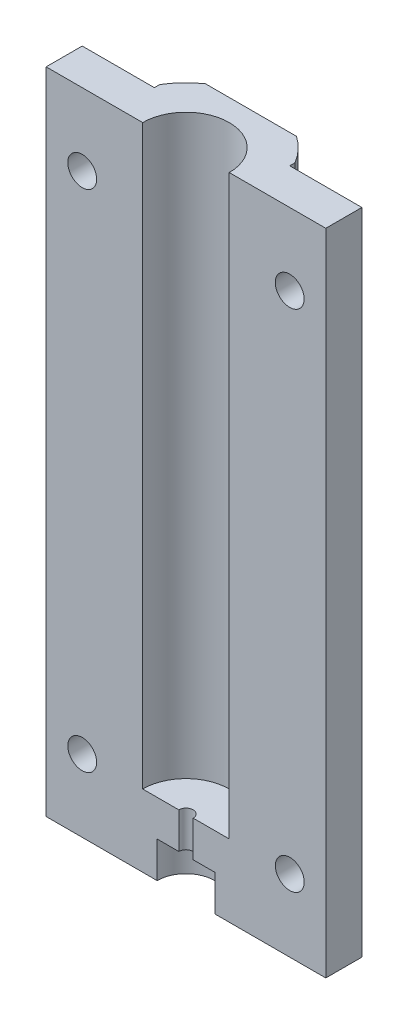
ISO-10303-21;
HEADER;
FILE_DESCRIPTION(('STEP AP214'),'2;1');
FILE_NAME('part.step','',(''),(''),'','','');
FILE_SCHEMA(('AUTOMOTIVE_DESIGN { 1 0 10303 214 1 1 1 1 }'));
ENDSEC;
DATA;
#1=APPLICATION_CONTEXT('core data for automotive mechanical design processes');
#2=APPLICATION_PROTOCOL_DEFINITION('international standard','automotive_design',2000,#1);
#3=PRODUCT_CONTEXT('',#1,'mechanical');
#4=PRODUCT('Part','Part','',(#3));
#5=PRODUCT_RELATED_PRODUCT_CATEGORY('part','',(#4));
#6=PRODUCT_DEFINITION_FORMATION('','',#4);
#7=PRODUCT_DEFINITION_CONTEXT('part definition',#1,'design');
#8=PRODUCT_DEFINITION('design','',#6,#7);
#9=PRODUCT_DEFINITION_SHAPE('','',#8);
#10=(LENGTH_UNIT() NAMED_UNIT(*) SI_UNIT(.MILLI.,.METRE.));
#11=(NAMED_UNIT(*) PLANE_ANGLE_UNIT() SI_UNIT($,.RADIAN.));
#12=(NAMED_UNIT(*) SI_UNIT($,.STERADIAN.) SOLID_ANGLE_UNIT());
#13=UNCERTAINTY_MEASURE_WITH_UNIT(LENGTH_MEASURE(1.E-05),#10,'distance_accuracy_value','');
#14=(GEOMETRIC_REPRESENTATION_CONTEXT(3) GLOBAL_UNCERTAINTY_ASSIGNED_CONTEXT((#13)) GLOBAL_UNIT_ASSIGNED_CONTEXT((#10,
#11,#12)) REPRESENTATION_CONTEXT('',''));
#15=CARTESIAN_POINT('',(0.,0.,0.));
#16=DIRECTION('',(0.,0.,1.));
#17=DIRECTION('',(1.,0.,0.));
#18=AXIS2_PLACEMENT_3D('',#15,#16,#17);
#19=CARTESIAN_POINT('',(0.,0.,0.));
#20=DIRECTION('',(0.,-1.,0.));
#21=DIRECTION('',(0.,0.,1.));
#22=AXIS2_PLACEMENT_3D('',#19,#20,#21);
#23=CYLINDRICAL_SURFACE('',#22,11.);
#24=CARTESIAN_POINT('',(0.,90.,0.));
#25=DIRECTION('',(0.,1.,0.));
#26=DIRECTION('',(0.,0.,1.));
#27=AXIS2_PLACEMENT_3D('',#24,#25,#26);
#28=CIRCLE('',#27,11.);
#29=CARTESIAN_POINT('',(-6.31136113976325,90.,-9.00925749235121));
#30=VERTEX_POINT('',#29);
#31=CARTESIAN_POINT('',(-9.3806248631069,90.,-5.74490010162584));
#32=VERTEX_POINT('',#31);
#33=EDGE_CURVE('E160',#30,#32,#28,.T.);
#34=ORIENTED_EDGE('',*,*,#33,.F.);
#35=DIRECTION('',(0.,-1.,0.));
#36=VECTOR('',#35,1.);
#37=CARTESIAN_POINT('',(-6.31136113976325,0.,-9.00925749235121));
#38=LINE('',#37,#36);
#39=CARTESIAN_POINT('',(-6.31136113976325,0.,-9.00925749235121));
#40=VERTEX_POINT('',#39);
#41=EDGE_CURVE('E11',#30,#40,#38,.T.);
#42=ORIENTED_EDGE('',*,*,#41,.T.);
#43=CARTESIAN_POINT('',(0.,0.,0.));
#44=DIRECTION('',(0.,1.,0.));
#45=DIRECTION('',(0.,0.,1.));
#46=AXIS2_PLACEMENT_3D('',#43,#44,#45);
#47=CIRCLE('',#46,11.);
#48=CARTESIAN_POINT('',(-9.3806248631069,0.,-5.74490010162584));
#49=VERTEX_POINT('',#48);
#50=EDGE_CURVE('E173',#40,#49,#47,.T.);
#51=ORIENTED_EDGE('',*,*,#50,.T.);
#52=DIRECTION('',(0.,-1.,0.));
#53=VECTOR('',#52,1.);
#54=CARTESIAN_POINT('',(-9.3806248631069,319.125736867983,-5.74490010162584));
#55=LINE('',#54,#53);
#56=EDGE_CURVE('E168',#32,#49,#55,.T.);
#57=ORIENTED_EDGE('',*,*,#56,.F.);
#58=EDGE_LOOP('',(#34,#42,#51,#57));
#59=FACE_BOUND('',#58,.T.);
#60=ADVANCED_FACE('F39',(#59),#23,.T.);
#61=CARTESIAN_POINT('',(0.,20.,0.));
#62=DIRECTION('',(0.,-1.,0.));
#63=DIRECTION('',(0.,0.,-1.));
#64=AXIS2_PLACEMENT_3D('',#61,#62,#63);
#65=CYLINDRICAL_SURFACE('',#64,1.);
#66=CARTESIAN_POINT('',(0.,5.,0.));
#67=DIRECTION('',(0.,-1.,0.));
#68=DIRECTION('',(0.,0.,-1.));
#69=AXIS2_PLACEMENT_3D('',#66,#67,#68);
#70=CIRCLE('',#69,1.);
#71=CARTESIAN_POINT('',(1.,5.,0.));
#72=VERTEX_POINT('',#71);
#73=CARTESIAN_POINT('',(-1.,5.,0.));
#74=VERTEX_POINT('',#73);
#75=EDGE_CURVE('E266',#72,#74,#70,.F.);
#76=ORIENTED_EDGE('',*,*,#75,.F.);
#77=DIRECTION('',(0.,-1.,0.));
#78=VECTOR('',#77,1.);
#79=CARTESIAN_POINT('',(1.,20.,0.));
#80=LINE('',#79,#78);
#81=CARTESIAN_POINT('',(1.,9.99999999999999,0.));
#82=VERTEX_POINT('',#81);
#83=EDGE_CURVE('E212',#72,#82,#80,.F.);
#84=ORIENTED_EDGE('',*,*,#83,.T.);
#85=CARTESIAN_POINT('',(0.,9.99999999999999,0.));
#86=DIRECTION('',(0.,-1.,0.));
#87=DIRECTION('',(0.,0.,-1.));
#88=AXIS2_PLACEMENT_3D('',#85,#86,#87);
#89=CIRCLE('',#88,1.);
#90=CARTESIAN_POINT('',(-1.,9.99999999999999,0.));
#91=VERTEX_POINT('',#90);
#92=EDGE_CURVE('E204',#91,#82,#89,.T.);
#93=ORIENTED_EDGE('',*,*,#92,.F.);
#94=DIRECTION('',(0.,-1.,0.));
#95=VECTOR('',#94,1.);
#96=CARTESIAN_POINT('',(-1.,20.,0.));
#97=LINE('',#96,#95);
#98=EDGE_CURVE('E208',#91,#74,#97,.T.);
#99=ORIENTED_EDGE('',*,*,#98,.T.);
#100=EDGE_LOOP('',(#76,#84,#93,#99));
#101=FACE_BOUND('',#100,.T.);
#102=ADVANCED_FACE('F381',(#101),#65,.F.);
#103=CARTESIAN_POINT('',(0.,0.,0.));
#104=DIRECTION('',(0.,1.,0.));
#105=DIRECTION('',(0.,0.,1.));
#106=AXIS2_PLACEMENT_3D('',#103,#104,#105);
#107=PLANE('',#106);
#108=ORIENTED_EDGE('',*,*,#50,.F.);
#109=DIRECTION('',(1.,0.,0.));
#110=VECTOR('',#109,1.);
#111=CARTESIAN_POINT('',(-10.4548474663646,0.,-9.00925749235121));
#112=LINE('',#111,#110);
#113=CARTESIAN_POINT('',(6.31136113976325,0.,-9.00925749235121));
#114=VERTEX_POINT('',#113);
#115=EDGE_CURVE('E152',#40,#114,#112,.T.);
#116=ORIENTED_EDGE('',*,*,#115,.T.);
#117=CARTESIAN_POINT('',(9.38062486310674,0.,-5.74490010162611));
#118=VERTEX_POINT('',#117);
#119=EDGE_CURVE('E178',#118,#114,#47,.T.);
#120=ORIENTED_EDGE('',*,*,#119,.F.);
#121=DIRECTION('',(0.,0.,-1.));
#122=VECTOR('',#121,1.);
#123=CARTESIAN_POINT('',(9.38062486310674,0.,-5.74490010162611));
#124=LINE('',#123,#122);
#125=CARTESIAN_POINT('',(9.38062486310675,0.,-5.00000000000013));
#126=VERTEX_POINT('',#125);
#127=EDGE_CURVE('E336',#126,#118,#124,.T.);
#128=ORIENTED_EDGE('',*,*,#127,.F.);
#129=DIRECTION('',(1.,0.,0.));
#130=VECTOR('',#129,1.);
#131=CARTESIAN_POINT('',(9.38062486310675,0.,-5.00000000000013));
#132=LINE('',#131,#130);
#133=CARTESIAN_POINT('',(19.3806248631068,0.,-5.00000000000027));
#134=VERTEX_POINT('',#133);
#135=EDGE_CURVE('E309',#126,#134,#132,.T.);
#136=ORIENTED_EDGE('',*,*,#135,.T.);
#137=DIRECTION('',(0.,0.,-1.));
#138=VECTOR('',#137,1.);
#139=CARTESIAN_POINT('',(19.3806248631068,0.,0.));
#140=LINE('',#139,#138);
#141=CARTESIAN_POINT('',(19.3806248631068,0.,0.));
#142=VERTEX_POINT('',#141);
#143=EDGE_CURVE('E183',#142,#134,#140,.T.);
#144=ORIENTED_EDGE('',*,*,#143,.F.);
#145=DIRECTION('',(1.,0.,0.));
#146=VECTOR('',#145,1.);
#147=CARTESIAN_POINT('',(-19.3806248631068,0.,0.));
#148=LINE('',#147,#146);
#149=CARTESIAN_POINT('',(4.,0.,0.));
#150=VERTEX_POINT('',#149);
#151=EDGE_CURVE('E278',#150,#142,#148,.T.);
#152=ORIENTED_EDGE('',*,*,#151,.F.);
#153=CARTESIAN_POINT('',(0.,0.,0.));
#154=DIRECTION('',(0.,-1.,0.));
#155=DIRECTION('',(0.,0.,-1.));
#156=AXIS2_PLACEMENT_3D('',#153,#154,#155);
#157=CIRCLE('',#156,4.);
#158=CARTESIAN_POINT('',(-4.,0.,0.));
#159=VERTEX_POINT('',#158);
#160=EDGE_CURVE('E260',#159,#150,#157,.T.);
#161=ORIENTED_EDGE('',*,*,#160,.F.);
#162=CARTESIAN_POINT('',(-19.3806248631068,0.,0.));
#163=VERTEX_POINT('',#162);
#164=EDGE_CURVE('E285',#163,#159,#148,.T.);
#165=ORIENTED_EDGE('',*,*,#164,.F.);
#166=DIRECTION('',(0.,0.,1.));
#167=VECTOR('',#166,1.);
#168=CARTESIAN_POINT('',(-19.3806248631068,0.,0.));
#169=LINE('',#168,#167);
#170=CARTESIAN_POINT('',(-19.3806248631069,0.,-4.99999999999973));
#171=VERTEX_POINT('',#170);
#172=EDGE_CURVE('E189',#171,#163,#169,.T.);
#173=ORIENTED_EDGE('',*,*,#172,.F.);
#174=DIRECTION('',(1.,0.,0.));
#175=VECTOR('',#174,1.);
#176=CARTESIAN_POINT('',(-9.38062486310688,0.,-4.99999999999987));
#177=LINE('',#176,#175);
#178=CARTESIAN_POINT('',(-9.38062486310688,0.,-4.99999999999987));
#179=VERTEX_POINT('',#178);
#180=EDGE_CURVE('E325',#171,#179,#177,.T.);
#181=ORIENTED_EDGE('',*,*,#180,.T.);
#182=DIRECTION('',(0.,0.,-1.));
#183=VECTOR('',#182,1.);
#184=CARTESIAN_POINT('',(-9.3806248631069,0.,-5.74490010162584));
#185=LINE('',#184,#183);
#186=EDGE_CURVE('E174',#179,#49,#185,.T.);
#187=ORIENTED_EDGE('',*,*,#186,.T.);
#188=EDGE_LOOP('',(#108,#116,#120,#128,#136,#144,#152,#161,#165,#173,#181,#187));
#189=FACE_BOUND('',#188,.T.);
#190=ADVANCED_FACE('F41',(#189),#107,.F.);
#191=CARTESIAN_POINT('',(11.,90.,0.));
#192=DIRECTION('',(0.,-1.,0.));
#193=DIRECTION('',(0.,0.,-1.));
#194=AXIS2_PLACEMENT_3D('',#191,#192,#193);
#195=PLANE('',#194);
#196=CARTESIAN_POINT('',(9.38062486310674,90.,-5.74490010162611));
#197=VERTEX_POINT('',#196);
#198=CARTESIAN_POINT('',(6.31136113976325,90.,-9.00925749235121));
#199=VERTEX_POINT('',#198);
#200=EDGE_CURVE('E163',#197,#199,#28,.T.);
#201=ORIENTED_EDGE('',*,*,#200,.T.);
#202=DIRECTION('',(1.,0.,0.));
#203=VECTOR('',#202,1.);
#204=CARTESIAN_POINT('',(-10.4548474663646,90.,-9.00925749235121));
#205=LINE('',#204,#203);
#206=EDGE_CURVE('E55',#30,#199,#205,.T.);
#207=ORIENTED_EDGE('',*,*,#206,.F.);
#208=ORIENTED_EDGE('',*,*,#33,.T.);
#209=DIRECTION('',(0.,0.,-1.));
#210=VECTOR('',#209,1.);
#211=CARTESIAN_POINT('',(-9.3806248631069,90.,-5.74490010162584));
#212=LINE('',#211,#210);
#213=CARTESIAN_POINT('',(-9.38062486310688,90.,-4.99999999999987));
#214=VERTEX_POINT('',#213);
#215=EDGE_CURVE('E350',#214,#32,#212,.T.);
#216=ORIENTED_EDGE('',*,*,#215,.F.);
#217=DIRECTION('',(1.,0.,0.));
#218=VECTOR('',#217,1.);
#219=CARTESIAN_POINT('',(-9.38062486310688,90.,-4.99999999999987));
#220=LINE('',#219,#218);
#221=CARTESIAN_POINT('',(-19.3806248631069,90.,-4.99999999999973));
#222=VERTEX_POINT('',#221);
#223=EDGE_CURVE('E321',#222,#214,#220,.T.);
#224=ORIENTED_EDGE('',*,*,#223,.F.);
#225=DIRECTION('',(0.,0.,1.));
#226=VECTOR('',#225,1.);
#227=CARTESIAN_POINT('',(-19.3806248631068,90.,0.));
#228=LINE('',#227,#226);
#229=CARTESIAN_POINT('',(-19.3806248631068,90.,0.));
#230=VERTEX_POINT('',#229);
#231=EDGE_CURVE('E186',#222,#230,#228,.T.);
#232=ORIENTED_EDGE('',*,*,#231,.T.);
#233=DIRECTION('',(1.,0.,0.));
#234=VECTOR('',#233,1.);
#235=CARTESIAN_POINT('',(-19.3806248631068,90.,0.));
#236=LINE('',#235,#234);
#237=CARTESIAN_POINT('',(-5.99999999999999,90.,0.));
#238=VERTEX_POINT('',#237);
#239=EDGE_CURVE('E279',#230,#238,#236,.T.);
#240=ORIENTED_EDGE('',*,*,#239,.T.);
#241=CARTESIAN_POINT('',(0.,90.,0.));
#242=DIRECTION('',(0.,-1.,0.));
#243=DIRECTION('',(0.,0.,-1.));
#244=AXIS2_PLACEMENT_3D('',#241,#242,#243);
#245=CIRCLE('',#244,6.);
#246=CARTESIAN_POINT('',(5.99999999999999,90.,0.));
#247=VERTEX_POINT('',#246);
#248=EDGE_CURVE('E200',#238,#247,#245,.T.);
#249=ORIENTED_EDGE('',*,*,#248,.T.);
#250=CARTESIAN_POINT('',(19.3806248631068,90.,0.));
#251=VERTEX_POINT('',#250);
#252=EDGE_CURVE('E284',#247,#251,#236,.T.);
#253=ORIENTED_EDGE('',*,*,#252,.T.);
#254=DIRECTION('',(0.,0.,-1.));
#255=VECTOR('',#254,1.);
#256=CARTESIAN_POINT('',(19.3806248631068,90.,0.));
#257=LINE('',#256,#255);
#258=CARTESIAN_POINT('',(19.3806248631068,90.,-5.00000000000027));
#259=VERTEX_POINT('',#258);
#260=EDGE_CURVE('E182',#251,#259,#257,.T.);
#261=ORIENTED_EDGE('',*,*,#260,.T.);
#262=DIRECTION('',(1.,0.,0.));
#263=VECTOR('',#262,1.);
#264=CARTESIAN_POINT('',(9.38062486310675,90.,-5.00000000000013));
#265=LINE('',#264,#263);
#266=CARTESIAN_POINT('',(9.38062486310675,90.,-5.00000000000013));
#267=VERTEX_POINT('',#266);
#268=EDGE_CURVE('E308',#267,#259,#265,.T.);
#269=ORIENTED_EDGE('',*,*,#268,.F.);
#270=DIRECTION('',(0.,0.,-1.));
#271=VECTOR('',#270,1.);
#272=CARTESIAN_POINT('',(9.38062486310674,90.,-5.74490010162611));
#273=LINE('',#272,#271);
#274=EDGE_CURVE('E340',#267,#197,#273,.T.);
#275=ORIENTED_EDGE('',*,*,#274,.T.);
#276=EDGE_LOOP('',(#201,#207,#208,#216,#224,#232,#240,#249,#253,#261,#269,#275));
#277=FACE_BOUND('',#276,.T.);
#278=ADVANCED_FACE('F158',(#277),#195,.F.);
#279=CARTESIAN_POINT('',(0.,0.,0.));
#280=DIRECTION('',(0.,-1.,0.));
#281=DIRECTION('',(0.,0.,-1.));
#282=AXIS2_PLACEMENT_3D('',#279,#280,#281);
#283=CYLINDRICAL_SURFACE('',#282,5.99999999999999);
#284=CARTESIAN_POINT('',(0.,9.99999999999999,0.));
#285=DIRECTION('',(0.,-1.,0.));
#286=DIRECTION('',(0.,0.,-1.));
#287=AXIS2_PLACEMENT_3D('',#284,#285,#286);
#288=CIRCLE('',#287,5.99999999999999);
#289=CARTESIAN_POINT('',(-5.99999999999999,9.99999999999999,0.));
#290=VERTEX_POINT('',#289);
#291=CARTESIAN_POINT('',(5.99999999999999,9.99999999999999,0.));
#292=VERTEX_POINT('',#291);
#293=EDGE_CURVE('E193',#290,#292,#288,.T.);
#294=ORIENTED_EDGE('',*,*,#293,.T.);
#295=DIRECTION('',(0.,-1.,0.));
#296=VECTOR('',#295,1.);
#297=CARTESIAN_POINT('',(5.99999999999999,0.,0.));
#298=LINE('',#297,#296);
#299=EDGE_CURVE('E304',#292,#247,#298,.F.);
#300=ORIENTED_EDGE('',*,*,#299,.T.);
#301=ORIENTED_EDGE('',*,*,#248,.F.);
#302=DIRECTION('',(0.,-1.,0.));
#303=VECTOR('',#302,1.);
#304=CARTESIAN_POINT('',(-5.99999999999999,0.,0.));
#305=LINE('',#304,#303);
#306=EDGE_CURVE('E299',#238,#290,#305,.T.);
#307=ORIENTED_EDGE('',*,*,#306,.T.);
#308=EDGE_LOOP('',(#294,#300,#301,#307));
#309=FACE_BOUND('',#308,.T.);
#310=ADVANCED_FACE('F388',(#309),#283,.F.);
#311=CARTESIAN_POINT('',(5.99999999999999,9.99999999999999,0.));
#312=DIRECTION('',(0.,-1.,0.));
#313=DIRECTION('',(0.,0.,-1.));
#314=AXIS2_PLACEMENT_3D('',#311,#312,#313);
#315=PLANE('',#314);
#316=ORIENTED_EDGE('',*,*,#293,.F.);
#317=DIRECTION('',(1.,0.,0.));
#318=VECTOR('',#317,1.);
#319=CARTESIAN_POINT('',(5.99999999999999,9.99999999999999,0.));
#320=LINE('',#319,#318);
#321=EDGE_CURVE('E293',#290,#91,#320,.T.);
#322=ORIENTED_EDGE('',*,*,#321,.T.);
#323=ORIENTED_EDGE('',*,*,#92,.T.);
#324=EDGE_CURVE('E300',#82,#292,#320,.T.);
#325=ORIENTED_EDGE('',*,*,#324,.T.);
#326=EDGE_LOOP('',(#316,#322,#323,#325));
#327=FACE_BOUND('',#326,.T.);
#328=ADVANCED_FACE('F385',(#327),#315,.F.);
#329=CARTESIAN_POINT('',(-19.3806248631068,0.,0.));
#330=DIRECTION('',(-1.,0.,0.));
#331=DIRECTION('',(0.,0.,1.));
#332=AXIS2_PLACEMENT_3D('',#329,#330,#331);
#333=PLANE('',#332);
#334=DIRECTION('',(0.,-1.,0.));
#335=VECTOR('',#334,1.);
#336=CARTESIAN_POINT('',(-19.3806248631068,90.,0.));
#337=LINE('',#336,#335);
#338=EDGE_CURVE('E283',#230,#163,#337,.T.);
#339=ORIENTED_EDGE('',*,*,#338,.F.);
#340=ORIENTED_EDGE('',*,*,#231,.F.);
#341=DIRECTION('',(0.,1.,0.));
#342=VECTOR('',#341,1.);
#343=CARTESIAN_POINT('',(-19.3806248631069,0.,-4.99999999999973));
#344=LINE('',#343,#342);
#345=EDGE_CURVE('E329',#171,#222,#344,.T.);
#346=ORIENTED_EDGE('',*,*,#345,.F.);
#347=ORIENTED_EDGE('',*,*,#172,.T.);
#348=EDGE_LOOP('',(#339,#340,#346,#347));
#349=FACE_BOUND('',#348,.T.);
#350=ADVANCED_FACE('F363',(#349),#333,.T.);
#351=CARTESIAN_POINT('',(19.3806248631068,0.,0.));
#352=DIRECTION('',(1.,0.,0.));
#353=DIRECTION('',(0.,0.,-1.));
#354=AXIS2_PLACEMENT_3D('',#351,#352,#353);
#355=PLANE('',#354);
#356=DIRECTION('',(0.,-1.,0.));
#357=VECTOR('',#356,1.);
#358=CARTESIAN_POINT('',(19.3806248631068,90.,0.));
#359=LINE('',#358,#357);
#360=EDGE_CURVE('E289',#251,#142,#359,.T.);
#361=ORIENTED_EDGE('',*,*,#360,.T.);
#362=ORIENTED_EDGE('',*,*,#143,.T.);
#363=DIRECTION('',(0.,1.,0.));
#364=VECTOR('',#363,1.);
#365=CARTESIAN_POINT('',(19.3806248631068,0.,-5.00000000000027));
#366=LINE('',#365,#364);
#367=EDGE_CURVE('E317',#134,#259,#366,.T.);
#368=ORIENTED_EDGE('',*,*,#367,.T.);
#369=ORIENTED_EDGE('',*,*,#260,.F.);
#370=EDGE_LOOP('',(#361,#362,#368,#369));
#371=FACE_BOUND('',#370,.T.);
#372=ADVANCED_FACE('F394',(#371),#355,.T.);
#373=CARTESIAN_POINT('',(9.38062486310674,-116.165089082647,-5.74490010162611));
#374=DIRECTION('',(1.,0.,0.));
#375=DIRECTION('',(0.,0.,1.));
#376=AXIS2_PLACEMENT_3D('',#373,#374,#375);
#377=PLANE('',#376);
#378=ORIENTED_EDGE('',*,*,#127,.T.);
#379=DIRECTION('',(0.,1.,0.));
#380=VECTOR('',#379,1.);
#381=CARTESIAN_POINT('',(9.38062486310674,-116.165089082647,-5.74490010162611));
#382=LINE('',#381,#380);
#383=EDGE_CURVE('E343',#118,#197,#382,.T.);
#384=ORIENTED_EDGE('',*,*,#383,.T.);
#385=ORIENTED_EDGE('',*,*,#274,.F.);
#386=DIRECTION('',(0.,1.,0.));
#387=VECTOR('',#386,1.);
#388=CARTESIAN_POINT('',(9.38062486310675,0.,-5.00000000000013));
#389=LINE('',#388,#387);
#390=EDGE_CURVE('E313',#126,#267,#389,.T.);
#391=ORIENTED_EDGE('',*,*,#390,.F.);
#392=EDGE_LOOP('',(#378,#384,#385,#391));
#393=FACE_BOUND('',#392,.T.);
#394=ADVANCED_FACE('F401',(#393),#377,.T.);
#395=ORIENTED_EDGE('',*,*,#119,.T.);
#396=DIRECTION('',(0.,-1.,0.));
#397=VECTOR('',#396,1.);
#398=CARTESIAN_POINT('',(6.31136113976325,0.,-9.00925749235121));
#399=LINE('',#398,#397);
#400=EDGE_CURVE('E48',#114,#199,#399,.F.);
#401=ORIENTED_EDGE('',*,*,#400,.T.);
#402=ORIENTED_EDGE('',*,*,#200,.F.);
#403=ORIENTED_EDGE('',*,*,#383,.F.);
#404=EDGE_LOOP('',(#395,#401,#402,#403));
#405=FACE_BOUND('',#404,.T.);
#406=ADVANCED_FACE('F223',(#405),#23,.T.);
#407=CARTESIAN_POINT('',(-9.3806248631069,319.125736867983,-5.74490010162584));
#408=DIRECTION('',(-1.,0.,0.));
#409=DIRECTION('',(0.,0.,-1.));
#410=AXIS2_PLACEMENT_3D('',#407,#408,#409);
#411=PLANE('',#410);
#412=DIRECTION('',(0.,1.,0.));
#413=VECTOR('',#412,1.);
#414=CARTESIAN_POINT('',(-9.38062486310688,0.,-4.99999999999987));
#415=LINE('',#414,#413);
#416=EDGE_CURVE('E333',#179,#214,#415,.T.);
#417=ORIENTED_EDGE('',*,*,#416,.T.);
#418=ORIENTED_EDGE('',*,*,#215,.T.);
#419=ORIENTED_EDGE('',*,*,#56,.T.);
#420=ORIENTED_EDGE('',*,*,#186,.F.);
#421=EDGE_LOOP('',(#417,#418,#419,#420));
#422=FACE_BOUND('',#421,.T.);
#423=ADVANCED_FACE('F354',(#422),#411,.T.);
#424=CARTESIAN_POINT('',(-9.38062486310688,0.,-4.99999999999987));
#425=DIRECTION('',(0.,0.,-1.));
#426=DIRECTION('',(1.,0.,0.));
#427=AXIS2_PLACEMENT_3D('',#424,#425,#426);
#428=PLANE('',#427);
#429=CARTESIAN_POINT('',(-14.3806248631069,80.,-4.9999999999998));
#430=DIRECTION('',(0.,0.,-1.));
#431=DIRECTION('',(-1.,0.,0.));
#432=AXIS2_PLACEMENT_3D('',#429,#430,#431);
#433=CIRCLE('',#432,2.);
#434=CARTESIAN_POINT('',(-16.3806248631069,80.,-4.99999999999977));
#435=VERTEX_POINT('',#434);
#436=EDGE_CURVE('E229',#435,#435,#433,.T.);
#437=ORIENTED_EDGE('',*,*,#436,.F.);
#438=EDGE_LOOP('',(#437));
#439=FACE_BOUND('',#438,.T.);
#440=CARTESIAN_POINT('',(-14.3806248631069,10.,-4.9999999999998));
#441=DIRECTION('',(0.,0.,-1.));
#442=DIRECTION('',(-1.,0.,0.));
#443=AXIS2_PLACEMENT_3D('',#440,#441,#442);
#444=CIRCLE('',#443,2.);
#445=CARTESIAN_POINT('',(-16.3806248631069,10.,-4.99999999999977));
#446=VERTEX_POINT('',#445);
#447=EDGE_CURVE('E249',#446,#446,#444,.T.);
#448=ORIENTED_EDGE('',*,*,#447,.F.);
#449=EDGE_LOOP('',(#448));
#450=FACE_BOUND('',#449,.T.);
#451=ORIENTED_EDGE('',*,*,#223,.T.);
#452=ORIENTED_EDGE('',*,*,#416,.F.);
#453=ORIENTED_EDGE('',*,*,#180,.F.);
#454=ORIENTED_EDGE('',*,*,#345,.T.);
#455=EDGE_LOOP('',(#451,#452,#453,#454));
#456=FACE_BOUND('',#455,.T.);
#457=ADVANCED_FACE('F358',(#439,#450,#456),#428,.T.);
#458=CARTESIAN_POINT('',(9.38062486310675,0.,-5.00000000000013));
#459=DIRECTION('',(0.,0.,-1.));
#460=DIRECTION('',(1.,0.,0.));
#461=AXIS2_PLACEMENT_3D('',#458,#459,#460);
#462=PLANE('',#461);
#463=CARTESIAN_POINT('',(14.3929590851214,10.,-5.0000000000002));
#464=DIRECTION('',(0.,0.,-1.));
#465=DIRECTION('',(-1.,0.,0.));
#466=AXIS2_PLACEMENT_3D('',#463,#464,#465);
#467=CIRCLE('',#466,2.);
#468=CARTESIAN_POINT('',(12.3929590851214,10.,-5.00000000000017));
#469=VERTEX_POINT('',#468);
#470=EDGE_CURVE('E241',#469,#469,#467,.T.);
#471=ORIENTED_EDGE('',*,*,#470,.F.);
#472=EDGE_LOOP('',(#471));
#473=FACE_BOUND('',#472,.T.);
#474=CARTESIAN_POINT('',(14.3806248631068,80.,-5.0000000000002));
#475=DIRECTION('',(0.,0.,-1.));
#476=DIRECTION('',(-1.,0.,0.));
#477=AXIS2_PLACEMENT_3D('',#474,#475,#476);
#478=CIRCLE('',#477,2.);
#479=CARTESIAN_POINT('',(12.3806248631068,80.,-5.00000000000017));
#480=VERTEX_POINT('',#479);
#481=EDGE_CURVE('E240',#480,#480,#478,.T.);
#482=ORIENTED_EDGE('',*,*,#481,.F.);
#483=EDGE_LOOP('',(#482));
#484=FACE_BOUND('',#483,.T.);
#485=ORIENTED_EDGE('',*,*,#268,.T.);
#486=ORIENTED_EDGE('',*,*,#367,.F.);
#487=ORIENTED_EDGE('',*,*,#135,.F.);
#488=ORIENTED_EDGE('',*,*,#390,.T.);
#489=EDGE_LOOP('',(#485,#486,#487,#488));
#490=FACE_BOUND('',#489,.T.);
#491=ADVANCED_FACE('F397',(#473,#484,#490),#462,.T.);
#492=CARTESIAN_POINT('',(-19.3806248631068,90.,0.));
#493=DIRECTION('',(0.,0.,-1.));
#494=DIRECTION('',(-1.,0.,0.));
#495=AXIS2_PLACEMENT_3D('',#492,#493,#494);
#496=PLANE('',#495);
#497=CARTESIAN_POINT('',(-14.3806248631068,80.,4.71844785465692E-13));
#498=DIRECTION('',(0.,0.,-1.));
#499=DIRECTION('',(-1.,0.,0.));
#500=AXIS2_PLACEMENT_3D('',#497,#498,#499);
#501=CIRCLE('',#500,2.);
#502=CARTESIAN_POINT('',(-16.3806248631068,80.,4.99776636176437E-13));
#503=VERTEX_POINT('',#502);
#504=EDGE_CURVE('E233',#503,#503,#501,.T.);
#505=ORIENTED_EDGE('',*,*,#504,.T.);
#506=EDGE_LOOP('',(#505));
#507=FACE_BOUND('',#506,.T.);
#508=CARTESIAN_POINT('',(-14.3806248631068,10.,4.71844785465692E-13));
#509=DIRECTION('',(0.,0.,-1.));
#510=DIRECTION('',(-1.,0.,0.));
#511=AXIS2_PLACEMENT_3D('',#508,#509,#510);
#512=CIRCLE('',#511,2.);
#513=CARTESIAN_POINT('',(-16.3806248631068,10.,4.99776636176437E-13));
#514=VERTEX_POINT('',#513);
#515=EDGE_CURVE('E245',#514,#514,#512,.T.);
#516=ORIENTED_EDGE('',*,*,#515,.T.);
#517=EDGE_LOOP('',(#516));
#518=FACE_BOUND('',#517,.T.);
#519=ORIENTED_EDGE('',*,*,#164,.T.);
#520=DIRECTION('',(0.,-1.,0.));
#521=VECTOR('',#520,1.);
#522=CARTESIAN_POINT('',(-4.,5.,0.));
#523=LINE('',#522,#521);
#524=CARTESIAN_POINT('',(-4.,5.,0.));
#525=VERTEX_POINT('',#524);
#526=EDGE_CURVE('E274',#159,#525,#523,.F.);
#527=ORIENTED_EDGE('',*,*,#526,.T.);
#528=DIRECTION('',(-1.,0.,0.));
#529=VECTOR('',#528,1.);
#530=CARTESIAN_POINT('',(-19.3806248631068,5.,0.));
#531=LINE('',#530,#529);
#532=EDGE_CURVE('E271',#74,#525,#531,.T.);
#533=ORIENTED_EDGE('',*,*,#532,.F.);
#534=ORIENTED_EDGE('',*,*,#98,.F.);
#535=ORIENTED_EDGE('',*,*,#321,.F.);
#536=ORIENTED_EDGE('',*,*,#306,.F.);
#537=ORIENTED_EDGE('',*,*,#239,.F.);
#538=ORIENTED_EDGE('',*,*,#338,.T.);
#539=EDGE_LOOP('',(#519,#527,#533,#534,#535,#536,#537,#538));
#540=FACE_BOUND('',#539,.T.);
#541=ADVANCED_FACE('F366',(#507,#518,#540),#496,.F.);
#542=CARTESIAN_POINT('',(14.3929590851215,10.,0.));
#543=DIRECTION('',(0.,0.,-1.));
#544=DIRECTION('',(-1.,0.,0.));
#545=AXIS2_PLACEMENT_3D('',#542,#543,#544);
#546=CIRCLE('',#545,2.);
#547=CARTESIAN_POINT('',(12.3929590851215,10.,0.));
#548=VERTEX_POINT('',#547);
#549=EDGE_CURVE('E236',#548,#548,#546,.T.);
#550=ORIENTED_EDGE('',*,*,#549,.T.);
#551=EDGE_LOOP('',(#550));
#552=FACE_BOUND('',#551,.T.);
#553=CARTESIAN_POINT('',(14.3806248631068,80.,0.));
#554=DIRECTION('',(0.,0.,-1.));
#555=DIRECTION('',(-1.,0.,0.));
#556=AXIS2_PLACEMENT_3D('',#553,#554,#555);
#557=CIRCLE('',#556,2.);
#558=CARTESIAN_POINT('',(12.3806248631068,80.,0.));
#559=VERTEX_POINT('',#558);
#560=EDGE_CURVE('E256',#559,#559,#557,.T.);
#561=ORIENTED_EDGE('',*,*,#560,.T.);
#562=EDGE_LOOP('',(#561));
#563=FACE_BOUND('',#562,.T.);
#564=DIRECTION('',(-1.,0.,0.));
#565=VECTOR('',#564,1.);
#566=CARTESIAN_POINT('',(-19.3806248631068,5.,0.));
#567=LINE('',#566,#565);
#568=CARTESIAN_POINT('',(4.,5.,0.));
#569=VERTEX_POINT('',#568);
#570=EDGE_CURVE('E215',#569,#72,#567,.T.);
#571=ORIENTED_EDGE('',*,*,#570,.F.);
#572=DIRECTION('',(0.,-1.,0.));
#573=VECTOR('',#572,1.);
#574=CARTESIAN_POINT('',(4.,5.,0.));
#575=LINE('',#574,#573);
#576=EDGE_CURVE('E218',#569,#150,#575,.T.);
#577=ORIENTED_EDGE('',*,*,#576,.T.);
#578=ORIENTED_EDGE('',*,*,#151,.T.);
#579=ORIENTED_EDGE('',*,*,#360,.F.);
#580=ORIENTED_EDGE('',*,*,#252,.F.);
#581=ORIENTED_EDGE('',*,*,#299,.F.);
#582=ORIENTED_EDGE('',*,*,#324,.F.);
#583=ORIENTED_EDGE('',*,*,#83,.F.);
#584=EDGE_LOOP('',(#571,#577,#578,#579,#580,#581,#582,#583));
#585=FACE_BOUND('',#584,.T.);
#586=ADVANCED_FACE('F374',(#552,#563,#585),#496,.F.);
#587=CARTESIAN_POINT('',(0.,5.,0.));
#588=DIRECTION('',(0.,-1.,0.));
#589=DIRECTION('',(0.,0.,-1.));
#590=AXIS2_PLACEMENT_3D('',#587,#588,#589);
#591=CYLINDRICAL_SURFACE('',#590,4.);
#592=ORIENTED_EDGE('',*,*,#160,.T.);
#593=ORIENTED_EDGE('',*,*,#576,.F.);
#594=CARTESIAN_POINT('',(0.,5.,0.));
#595=DIRECTION('',(0.,-1.,0.));
#596=DIRECTION('',(0.,0.,-1.));
#597=AXIS2_PLACEMENT_3D('',#594,#595,#596);
#598=CIRCLE('',#597,4.);
#599=EDGE_CURVE('E63',#525,#569,#598,.T.);
#600=ORIENTED_EDGE('',*,*,#599,.F.);
#601=ORIENTED_EDGE('',*,*,#526,.F.);
#602=EDGE_LOOP('',(#592,#593,#600,#601));
#603=FACE_BOUND('',#602,.T.);
#604=ADVANCED_FACE('F371',(#603),#591,.F.);
#605=CARTESIAN_POINT('',(0.,5.,0.));
#606=DIRECTION('',(0.,-1.,0.));
#607=DIRECTION('',(0.,0.,-1.));
#608=AXIS2_PLACEMENT_3D('',#605,#606,#607);
#609=PLANE('',#608);
#610=ORIENTED_EDGE('',*,*,#532,.T.);
#611=ORIENTED_EDGE('',*,*,#599,.T.);
#612=ORIENTED_EDGE('',*,*,#570,.T.);
#613=ORIENTED_EDGE('',*,*,#75,.T.);
#614=EDGE_LOOP('',(#610,#611,#612,#613));
#615=FACE_BOUND('',#614,.T.);
#616=ADVANCED_FACE('F378',(#615),#609,.T.);
#617=CARTESIAN_POINT('',(14.3806248631068,80.,0.));
#618=DIRECTION('',(0.,0.,-1.));
#619=DIRECTION('',(-1.,0.,0.));
#620=AXIS2_PLACEMENT_3D('',#617,#618,#619);
#621=CYLINDRICAL_SURFACE('',#620,2.);
#622=ORIENTED_EDGE('',*,*,#560,.F.);
#623=EDGE_LOOP('',(#622));
#624=FACE_BOUND('',#623,.T.);
#625=ORIENTED_EDGE('',*,*,#481,.T.);
#626=EDGE_LOOP('',(#625));
#627=FACE_BOUND('',#626,.T.);
#628=ADVANCED_FACE('F453',(#624,#627),#621,.F.);
#629=CARTESIAN_POINT('',(14.3929590851215,10.,0.));
#630=DIRECTION('',(0.,0.,-1.));
#631=DIRECTION('',(-1.,0.,0.));
#632=AXIS2_PLACEMENT_3D('',#629,#630,#631);
#633=CYLINDRICAL_SURFACE('',#632,2.);
#634=ORIENTED_EDGE('',*,*,#549,.F.);
#635=EDGE_LOOP('',(#634));
#636=FACE_BOUND('',#635,.T.);
#637=ORIENTED_EDGE('',*,*,#470,.T.);
#638=EDGE_LOOP('',(#637));
#639=FACE_BOUND('',#638,.T.);
#640=ADVANCED_FACE('F460',(#636,#639),#633,.F.);
#641=CARTESIAN_POINT('',(-14.3806248631068,10.,4.71844785465692E-13));
#642=DIRECTION('',(0.,0.,-1.));
#643=DIRECTION('',(-1.,0.,0.));
#644=AXIS2_PLACEMENT_3D('',#641,#642,#643);
#645=CYLINDRICAL_SURFACE('',#644,2.);
#646=ORIENTED_EDGE('',*,*,#515,.F.);
#647=EDGE_LOOP('',(#646));
#648=FACE_BOUND('',#647,.T.);
#649=ORIENTED_EDGE('',*,*,#447,.T.);
#650=EDGE_LOOP('',(#649));
#651=FACE_BOUND('',#650,.T.);
#652=ADVANCED_FACE('F468',(#648,#651),#645,.F.);
#653=CARTESIAN_POINT('',(-14.3806248631068,80.,4.71844785465692E-13));
#654=DIRECTION('',(0.,0.,-1.));
#655=DIRECTION('',(-1.,0.,0.));
#656=AXIS2_PLACEMENT_3D('',#653,#654,#655);
#657=CYLINDRICAL_SURFACE('',#656,2.);
#658=ORIENTED_EDGE('',*,*,#504,.F.);
#659=EDGE_LOOP('',(#658));
#660=FACE_BOUND('',#659,.T.);
#661=ORIENTED_EDGE('',*,*,#436,.T.);
#662=EDGE_LOOP('',(#661));
#663=FACE_BOUND('',#662,.T.);
#664=ADVANCED_FACE('F476',(#660,#663),#657,.F.);
#665=CARTESIAN_POINT('',(-10.4548474663646,0.,-9.00925749235121));
#666=DIRECTION('',(0.,0.,1.));
#667=DIRECTION('',(1.,0.,0.));
#668=AXIS2_PLACEMENT_3D('',#665,#666,#667);
#669=PLANE('',#668);
#670=ORIENTED_EDGE('',*,*,#206,.T.);
#671=ORIENTED_EDGE('',*,*,#400,.F.);
#672=ORIENTED_EDGE('',*,*,#115,.F.);
#673=ORIENTED_EDGE('',*,*,#41,.F.);
#674=EDGE_LOOP('',(#670,#671,#672,#673));
#675=FACE_BOUND('',#674,.T.);
#676=ADVANCED_FACE('F150',(#675),#669,.F.);
#677=CLOSED_SHELL('',(#60,#102,#190,#278,#310,#328,#350,#372,#394,#406,#423,#457,#491,#541,#586,
#604,#616,#628,#640,#652,#664,#676));
#678=MANIFOLD_SOLID_BREP('B2',#677);
#679=ADVANCED_BREP_SHAPE_REPRESENTATION('',(#18,#678),#14);
#680=SHAPE_DEFINITION_REPRESENTATION(#9,#679);
ENDSEC;
END-ISO-10303-21;
